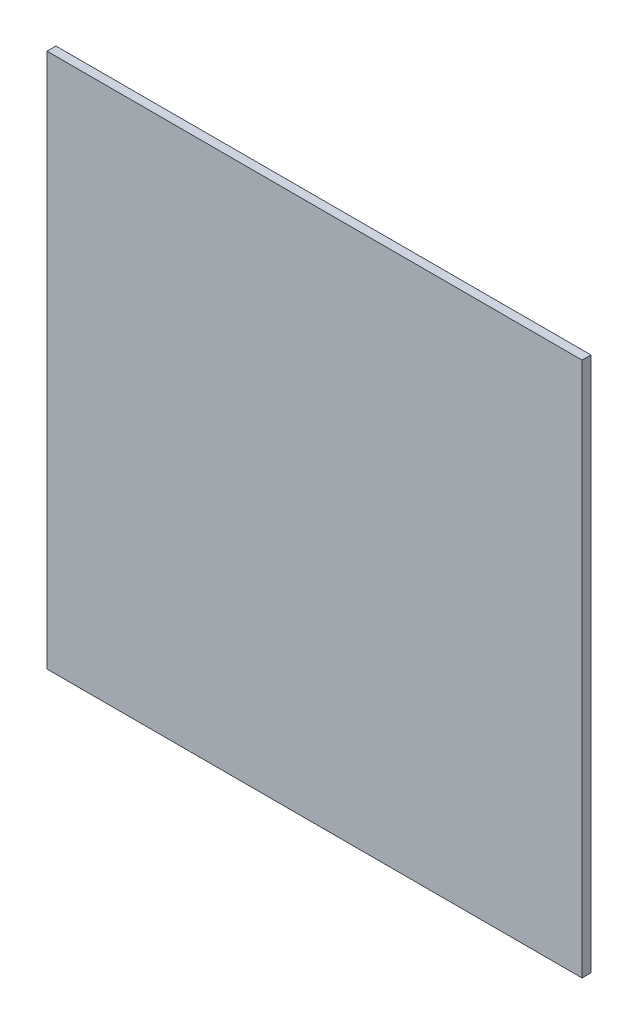
ISO-10303-21;
HEADER;
FILE_DESCRIPTION(('STEP AP214'),'2;1');
FILE_NAME('part.step','',(''),(''),'','','');
FILE_SCHEMA(('AUTOMOTIVE_DESIGN { 1 0 10303 214 1 1 1 1 }'));
ENDSEC;
DATA;
#1=APPLICATION_CONTEXT('core data for automotive mechanical design processes');
#2=APPLICATION_PROTOCOL_DEFINITION('international standard','automotive_design',2000,#1);
#3=PRODUCT_CONTEXT('',#1,'mechanical');
#4=PRODUCT('Part','Part','',(#3));
#5=PRODUCT_RELATED_PRODUCT_CATEGORY('part','',(#4));
#6=PRODUCT_DEFINITION_FORMATION('','',#4);
#7=PRODUCT_DEFINITION_CONTEXT('part definition',#1,'design');
#8=PRODUCT_DEFINITION('design','',#6,#7);
#9=PRODUCT_DEFINITION_SHAPE('','',#8);
#10=(LENGTH_UNIT() NAMED_UNIT(*) SI_UNIT(.MILLI.,.METRE.));
#11=(NAMED_UNIT(*) PLANE_ANGLE_UNIT() SI_UNIT($,.RADIAN.));
#12=(NAMED_UNIT(*) SI_UNIT($,.STERADIAN.) SOLID_ANGLE_UNIT());
#13=UNCERTAINTY_MEASURE_WITH_UNIT(LENGTH_MEASURE(1.E-05),#10,'distance_accuracy_value','');
#14=(GEOMETRIC_REPRESENTATION_CONTEXT(3) GLOBAL_UNCERTAINTY_ASSIGNED_CONTEXT((#13)) GLOBAL_UNIT_ASSIGNED_CONTEXT((#10,
#11,#12)) REPRESENTATION_CONTEXT('',''));
#15=CARTESIAN_POINT('',(0.,0.,0.));
#16=DIRECTION('',(0.,0.,1.));
#17=DIRECTION('',(1.,0.,0.));
#18=AXIS2_PLACEMENT_3D('',#15,#16,#17);
#19=CARTESIAN_POINT('',(-180.,180.,6.));
#20=DIRECTION('',(1.,0.,0.));
#21=DIRECTION('',(0.,1.,0.));
#22=AXIS2_PLACEMENT_3D('',#19,#20,#21);
#23=PLANE('',#22);
#24=DIRECTION('',(0.,-1.,0.));
#25=VECTOR('',#24,1.);
#26=CARTESIAN_POINT('',(-180.,180.,0.));
#27=LINE('',#26,#25);
#28=CARTESIAN_POINT('',(-180.,180.,0.));
#29=VERTEX_POINT('',#28);
#30=CARTESIAN_POINT('',(-180.,-180.,0.));
#31=VERTEX_POINT('',#30);
#32=EDGE_CURVE('E189',#29,#31,#27,.T.);
#33=ORIENTED_EDGE('',*,*,#32,.T.);
#34=DIRECTION('',(0.,0.,-1.));
#35=VECTOR('',#34,1.);
#36=CARTESIAN_POINT('',(-180.,-180.,6.));
#37=LINE('',#36,#35);
#38=CARTESIAN_POINT('',(-180.,-180.,6.));
#39=VERTEX_POINT('',#38);
#40=EDGE_CURVE('E11',#39,#31,#37,.T.);
#41=ORIENTED_EDGE('',*,*,#40,.F.);
#42=DIRECTION('',(0.,-1.,0.));
#43=VECTOR('',#42,1.);
#44=CARTESIAN_POINT('',(-180.,180.,6.));
#45=LINE('',#44,#43);
#46=CARTESIAN_POINT('',(-180.,180.,6.));
#47=VERTEX_POINT('',#46);
#48=EDGE_CURVE('E191',#47,#39,#45,.T.);
#49=ORIENTED_EDGE('',*,*,#48,.F.);
#50=DIRECTION('',(0.,0.,-1.));
#51=VECTOR('',#50,1.);
#52=CARTESIAN_POINT('',(-180.,180.,6.));
#53=LINE('',#52,#51);
#54=EDGE_CURVE('E201',#47,#29,#53,.T.);
#55=ORIENTED_EDGE('',*,*,#54,.T.);
#56=EDGE_LOOP('',(#33,#41,#49,#55));
#57=FACE_BOUND('',#56,.T.);
#58=ADVANCED_FACE('F32',(#57),#23,.F.);
#59=CARTESIAN_POINT('',(-180.,-180.,6.));
#60=DIRECTION('',(0.,1.,0.));
#61=DIRECTION('',(-1.,0.,0.));
#62=AXIS2_PLACEMENT_3D('',#59,#60,#61);
#63=PLANE('',#62);
#64=DIRECTION('',(1.,0.,0.));
#65=VECTOR('',#64,1.);
#66=CARTESIAN_POINT('',(-180.,-180.,0.));
#67=LINE('',#66,#65);
#68=CARTESIAN_POINT('',(180.,-180.,0.));
#69=VERTEX_POINT('',#68);
#70=EDGE_CURVE('E204',#31,#69,#67,.T.);
#71=ORIENTED_EDGE('',*,*,#70,.T.);
#72=DIRECTION('',(0.,0.,-1.));
#73=VECTOR('',#72,1.);
#74=CARTESIAN_POINT('',(180.,-180.,6.));
#75=LINE('',#74,#73);
#76=CARTESIAN_POINT('',(180.,-180.,6.));
#77=VERTEX_POINT('',#76);
#78=EDGE_CURVE('E39',#77,#69,#75,.T.);
#79=ORIENTED_EDGE('',*,*,#78,.F.);
#80=DIRECTION('',(1.,0.,0.));
#81=VECTOR('',#80,1.);
#82=CARTESIAN_POINT('',(-180.,-180.,6.));
#83=LINE('',#82,#81);
#84=EDGE_CURVE('E194',#39,#77,#83,.T.);
#85=ORIENTED_EDGE('',*,*,#84,.F.);
#86=ORIENTED_EDGE('',*,*,#40,.T.);
#87=EDGE_LOOP('',(#71,#79,#85,#86));
#88=FACE_BOUND('',#87,.T.);
#89=ADVANCED_FACE('F234',(#88),#63,.F.);
#90=CARTESIAN_POINT('',(180.,180.,6.));
#91=DIRECTION('',(-1.,0.,0.));
#92=DIRECTION('',(0.,-1.,0.));
#93=AXIS2_PLACEMENT_3D('',#90,#91,#92);
#94=PLANE('',#93);
#95=DIRECTION('',(0.,1.,0.));
#96=VECTOR('',#95,1.);
#97=CARTESIAN_POINT('',(180.,180.,0.));
#98=LINE('',#97,#96);
#99=CARTESIAN_POINT('',(180.,180.,0.));
#100=VERTEX_POINT('',#99);
#101=EDGE_CURVE('E206',#69,#100,#98,.T.);
#102=ORIENTED_EDGE('',*,*,#101,.T.);
#103=DIRECTION('',(0.,0.,-1.));
#104=VECTOR('',#103,1.);
#105=CARTESIAN_POINT('',(180.,180.,6.));
#106=LINE('',#105,#104);
#107=CARTESIAN_POINT('',(180.,180.,6.));
#108=VERTEX_POINT('',#107);
#109=EDGE_CURVE('E211',#108,#100,#106,.T.);
#110=ORIENTED_EDGE('',*,*,#109,.F.);
#111=DIRECTION('',(0.,1.,0.));
#112=VECTOR('',#111,1.);
#113=CARTESIAN_POINT('',(180.,180.,6.));
#114=LINE('',#113,#112);
#115=EDGE_CURVE('E197',#77,#108,#114,.T.);
#116=ORIENTED_EDGE('',*,*,#115,.F.);
#117=ORIENTED_EDGE('',*,*,#78,.T.);
#118=EDGE_LOOP('',(#102,#110,#116,#117));
#119=FACE_BOUND('',#118,.T.);
#120=ADVANCED_FACE('F218',(#119),#94,.F.);
#121=CARTESIAN_POINT('',(-180.,180.,6.));
#122=DIRECTION('',(0.,-1.,0.));
#123=DIRECTION('',(1.,0.,0.));
#124=AXIS2_PLACEMENT_3D('',#121,#122,#123);
#125=PLANE('',#124);
#126=DIRECTION('',(-1.,0.,0.));
#127=VECTOR('',#126,1.);
#128=CARTESIAN_POINT('',(-180.,180.,0.));
#129=LINE('',#128,#127);
#130=EDGE_CURVE('E195',#100,#29,#129,.T.);
#131=ORIENTED_EDGE('',*,*,#130,.T.);
#132=ORIENTED_EDGE('',*,*,#54,.F.);
#133=DIRECTION('',(-1.,0.,0.));
#134=VECTOR('',#133,1.);
#135=CARTESIAN_POINT('',(-180.,180.,6.));
#136=LINE('',#135,#134);
#137=EDGE_CURVE('E199',#108,#47,#136,.T.);
#138=ORIENTED_EDGE('',*,*,#137,.F.);
#139=ORIENTED_EDGE('',*,*,#109,.T.);
#140=EDGE_LOOP('',(#131,#132,#138,#139));
#141=FACE_BOUND('',#140,.T.);
#142=ADVANCED_FACE('F227',(#141),#125,.F.);
#143=CARTESIAN_POINT('',(0.,0.,6.));
#144=DIRECTION('',(0.,0.,1.));
#145=DIRECTION('',(1.,0.,0.));
#146=AXIS2_PLACEMENT_3D('',#143,#144,#145);
#147=PLANE('',#146);
#148=ORIENTED_EDGE('',*,*,#48,.T.);
#149=ORIENTED_EDGE('',*,*,#84,.T.);
#150=ORIENTED_EDGE('',*,*,#115,.T.);
#151=ORIENTED_EDGE('',*,*,#137,.T.);
#152=EDGE_LOOP('',(#148,#149,#150,#151));
#153=FACE_BOUND('',#152,.T.);
#154=ADVANCED_FACE('F233',(#153),#147,.T.);
#155=CARTESIAN_POINT('',(0.,0.,0.));
#156=DIRECTION('',(0.,0.,1.));
#157=DIRECTION('',(1.,0.,0.));
#158=AXIS2_PLACEMENT_3D('',#155,#156,#157);
#159=PLANE('',#158);
#160=DIRECTION('',(-1.,0.,0.));
#161=VECTOR('',#160,1.);
#162=CARTESIAN_POINT('',(100.,-131.,0.));
#163=LINE('',#162,#161);
#164=CARTESIAN_POINT('',(81.,-131.,0.));
#165=VERTEX_POINT('',#164);
#166=CARTESIAN_POINT('',(-81.,-131.,0.));
#167=VERTEX_POINT('',#166);
#168=EDGE_CURVE('E182',#165,#167,#163,.T.);
#169=ORIENTED_EDGE('',*,*,#168,.T.);
#170=DIRECTION('',(0.,-1.,0.));
#171=VECTOR('',#170,1.);
#172=CARTESIAN_POINT('',(-81.,-131.,0.));
#173=LINE('',#172,#171);
#174=CARTESIAN_POINT('',(-81.,86.4679434480897,0.));
#175=VERTEX_POINT('',#174);
#176=EDGE_CURVE('E46',#175,#167,#173,.T.);
#177=ORIENTED_EDGE('',*,*,#176,.F.);
#178=DIRECTION('',(-1.,0.,0.));
#179=VECTOR('',#178,1.);
#180=CARTESIAN_POINT('',(-81.,86.4679434480897,0.));
#181=LINE('',#180,#179);
#182=CARTESIAN_POINT('',(-100.,86.4679434480897,0.));
#183=VERTEX_POINT('',#182);
#184=EDGE_CURVE('E130',#175,#183,#181,.T.);
#185=ORIENTED_EDGE('',*,*,#184,.T.);
#186=DIRECTION('',(0.,-1.,0.));
#187=VECTOR('',#186,1.);
#188=CARTESIAN_POINT('',(-100.,-131.,0.));
#189=LINE('',#188,#187);
#190=CARTESIAN_POINT('',(-100.,-150.,0.));
#191=VERTEX_POINT('',#190);
#192=EDGE_CURVE('E54',#183,#191,#189,.T.);
#193=ORIENTED_EDGE('',*,*,#192,.T.);
#194=DIRECTION('',(1.,0.,0.));
#195=VECTOR('',#194,1.);
#196=CARTESIAN_POINT('',(100.,-150.,0.));
#197=LINE('',#196,#195);
#198=CARTESIAN_POINT('',(100.,-150.,0.));
#199=VERTEX_POINT('',#198);
#200=EDGE_CURVE('E174',#191,#199,#197,.T.);
#201=ORIENTED_EDGE('',*,*,#200,.T.);
#202=DIRECTION('',(0.,1.,0.));
#203=VECTOR('',#202,1.);
#204=CARTESIAN_POINT('',(100.,-131.,0.));
#205=LINE('',#204,#203);
#206=CARTESIAN_POINT('',(100.,86.4679434480897,0.));
#207=VERTEX_POINT('',#206);
#208=EDGE_CURVE('E168',#199,#207,#205,.T.);
#209=ORIENTED_EDGE('',*,*,#208,.T.);
#210=DIRECTION('',(1.,0.,0.));
#211=VECTOR('',#210,1.);
#212=CARTESIAN_POINT('',(81.,86.4679434480897,0.));
#213=LINE('',#212,#211);
#214=CARTESIAN_POINT('',(81.,86.4679434480897,0.));
#215=VERTEX_POINT('',#214);
#216=EDGE_CURVE('E165',#215,#207,#213,.T.);
#217=ORIENTED_EDGE('',*,*,#216,.F.);
#218=DIRECTION('',(0.,-1.,0.));
#219=VECTOR('',#218,1.);
#220=CARTESIAN_POINT('',(81.,-131.,0.));
#221=LINE('',#220,#219);
#222=EDGE_CURVE('E160',#215,#165,#221,.T.);
#223=ORIENTED_EDGE('',*,*,#222,.T.);
#224=EDGE_LOOP('',(#169,#177,#185,#193,#201,#209,#217,#223));
#225=FACE_BOUND('',#224,.T.);
#226=ORIENTED_EDGE('',*,*,#32,.F.);
#227=ORIENTED_EDGE('',*,*,#130,.F.);
#228=ORIENTED_EDGE('',*,*,#101,.F.);
#229=ORIENTED_EDGE('',*,*,#70,.F.);
#230=EDGE_LOOP('',(#226,#227,#228,#229));
#231=FACE_BOUND('',#230,.T.);
#232=ADVANCED_FACE('F224',(#225,#231),#159,.F.);
#233=CARTESIAN_POINT('',(100.,-131.,-70.));
#234=DIRECTION('',(1.,0.,0.));
#235=DIRECTION('',(0.,0.,-1.));
#236=AXIS2_PLACEMENT_3D('',#233,#234,#235);
#237=PLANE('',#236);
#238=ORIENTED_EDGE('',*,*,#208,.F.);
#239=DIRECTION('',(0.,0.,1.));
#240=VECTOR('',#239,1.);
#241=CARTESIAN_POINT('',(100.,-150.,-70.));
#242=LINE('',#241,#240);
#243=CARTESIAN_POINT('',(100.,-150.,-70.));
#244=VERTEX_POINT('',#243);
#245=EDGE_CURVE('E187',#244,#199,#242,.T.);
#246=ORIENTED_EDGE('',*,*,#245,.F.);
#247=DIRECTION('',(0.,1.,0.));
#248=VECTOR('',#247,1.);
#249=CARTESIAN_POINT('',(100.,-131.,-70.));
#250=LINE('',#249,#248);
#251=CARTESIAN_POINT('',(100.,-11.,-70.));
#252=VERTEX_POINT('',#251);
#253=EDGE_CURVE('E171',#244,#252,#250,.T.);
#254=ORIENTED_EDGE('',*,*,#253,.T.);
#255=DIRECTION('',(0.,0.812232862067414,0.583333333333333));
#256=VECTOR('',#255,1.);
#257=CARTESIAN_POINT('',(100.,86.4679434480897,0.));
#258=LINE('',#257,#256);
#259=EDGE_CURVE('E141',#252,#207,#258,.T.);
#260=ORIENTED_EDGE('',*,*,#259,.T.);
#261=EDGE_LOOP('',(#238,#246,#254,#260));
#262=FACE_BOUND('',#261,.T.);
#263=ADVANCED_FACE('F246',(#262),#237,.T.);
#264=CARTESIAN_POINT('',(100.,-150.,-70.));
#265=DIRECTION('',(0.,-1.,0.));
#266=DIRECTION('',(0.,0.,-1.));
#267=AXIS2_PLACEMENT_3D('',#264,#265,#266);
#268=PLANE('',#267);
#269=ORIENTED_EDGE('',*,*,#200,.F.);
#270=DIRECTION('',(0.,0.,1.));
#271=VECTOR('',#270,1.);
#272=CARTESIAN_POINT('',(-100.,-150.,-70.));
#273=LINE('',#272,#271);
#274=CARTESIAN_POINT('',(-100.,-150.,-70.));
#275=VERTEX_POINT('',#274);
#276=EDGE_CURVE('E180',#275,#191,#273,.T.);
#277=ORIENTED_EDGE('',*,*,#276,.F.);
#278=DIRECTION('',(1.,0.,0.));
#279=VECTOR('',#278,1.);
#280=CARTESIAN_POINT('',(100.,-150.,-70.));
#281=LINE('',#280,#279);
#282=EDGE_CURVE('E177',#275,#244,#281,.T.);
#283=ORIENTED_EDGE('',*,*,#282,.T.);
#284=ORIENTED_EDGE('',*,*,#245,.T.);
#285=EDGE_LOOP('',(#269,#277,#283,#284));
#286=FACE_BOUND('',#285,.T.);
#287=ADVANCED_FACE('F251',(#286),#268,.T.);
#288=CARTESIAN_POINT('',(-100.,-131.,-70.));
#289=DIRECTION('',(-1.,0.,0.));
#290=DIRECTION('',(0.,-1.,0.));
#291=AXIS2_PLACEMENT_3D('',#288,#289,#290);
#292=PLANE('',#291);
#293=ORIENTED_EDGE('',*,*,#192,.F.);
#294=DIRECTION('',(0.,0.812232862067414,0.583333333333333));
#295=VECTOR('',#294,1.);
#296=CARTESIAN_POINT('',(-100.,86.4679434480897,0.));
#297=LINE('',#296,#295);
#298=CARTESIAN_POINT('',(-100.,-11.,-70.));
#299=VERTEX_POINT('',#298);
#300=EDGE_CURVE('E148',#299,#183,#297,.T.);
#301=ORIENTED_EDGE('',*,*,#300,.F.);
#302=DIRECTION('',(0.,-1.,0.));
#303=VECTOR('',#302,1.);
#304=CARTESIAN_POINT('',(-100.,-131.,-70.));
#305=LINE('',#304,#303);
#306=EDGE_CURVE('E138',#299,#275,#305,.T.);
#307=ORIENTED_EDGE('',*,*,#306,.T.);
#308=ORIENTED_EDGE('',*,*,#276,.T.);
#309=EDGE_LOOP('',(#293,#301,#307,#308));
#310=FACE_BOUND('',#309,.T.);
#311=ADVANCED_FACE('F256',(#310),#292,.T.);
#312=CARTESIAN_POINT('',(100.,-131.,-70.));
#313=DIRECTION('',(0.,1.,0.));
#314=DIRECTION('',(0.,0.,1.));
#315=AXIS2_PLACEMENT_3D('',#312,#313,#314);
#316=PLANE('',#315);
#317=DIRECTION('',(0.,0.,-1.));
#318=VECTOR('',#317,1.);
#319=CARTESIAN_POINT('',(-81.,-131.,-70.));
#320=LINE('',#319,#318);
#321=CARTESIAN_POINT('',(-81.,-131.,-70.));
#322=VERTEX_POINT('',#321);
#323=EDGE_CURVE('E128',#167,#322,#320,.T.);
#324=ORIENTED_EDGE('',*,*,#323,.F.);
#325=ORIENTED_EDGE('',*,*,#168,.F.);
#326=DIRECTION('',(0.,0.,-1.));
#327=VECTOR('',#326,1.);
#328=CARTESIAN_POINT('',(81.,-131.,-70.));
#329=LINE('',#328,#327);
#330=CARTESIAN_POINT('',(81.,-131.,-70.));
#331=VERTEX_POINT('',#330);
#332=EDGE_CURVE('E151',#165,#331,#329,.T.);
#333=ORIENTED_EDGE('',*,*,#332,.T.);
#334=DIRECTION('',(-1.,0.,0.));
#335=VECTOR('',#334,1.);
#336=CARTESIAN_POINT('',(100.,-131.,-70.));
#337=LINE('',#336,#335);
#338=EDGE_CURVE('E173',#331,#322,#337,.T.);
#339=ORIENTED_EDGE('',*,*,#338,.T.);
#340=EDGE_LOOP('',(#324,#325,#333,#339));
#341=FACE_BOUND('',#340,.T.);
#342=ADVANCED_FACE('F253',(#341),#316,.T.);
#343=CARTESIAN_POINT('',(0.,0.,-70.));
#344=DIRECTION('',(0.,0.,-1.));
#345=DIRECTION('',(-1.,0.,0.));
#346=AXIS2_PLACEMENT_3D('',#343,#344,#345);
#347=PLANE('',#346);
#348=ORIENTED_EDGE('',*,*,#253,.F.);
#349=ORIENTED_EDGE('',*,*,#282,.F.);
#350=ORIENTED_EDGE('',*,*,#306,.F.);
#351=DIRECTION('',(-1.,0.,0.));
#352=VECTOR('',#351,1.);
#353=CARTESIAN_POINT('',(-81.,-11.,-70.));
#354=LINE('',#353,#352);
#355=CARTESIAN_POINT('',(-81.,-11.,-70.));
#356=VERTEX_POINT('',#355);
#357=EDGE_CURVE('E133',#356,#299,#354,.T.);
#358=ORIENTED_EDGE('',*,*,#357,.F.);
#359=DIRECTION('',(0.,1.,0.));
#360=VECTOR('',#359,1.);
#361=CARTESIAN_POINT('',(-81.,-11.,-70.));
#362=LINE('',#361,#360);
#363=EDGE_CURVE('E122',#322,#356,#362,.T.);
#364=ORIENTED_EDGE('',*,*,#363,.F.);
#365=ORIENTED_EDGE('',*,*,#338,.F.);
#366=DIRECTION('',(0.,1.,0.));
#367=VECTOR('',#366,1.);
#368=CARTESIAN_POINT('',(81.,-11.,-70.));
#369=LINE('',#368,#367);
#370=CARTESIAN_POINT('',(81.,-11.,-70.));
#371=VERTEX_POINT('',#370);
#372=EDGE_CURVE('E154',#331,#371,#369,.T.);
#373=ORIENTED_EDGE('',*,*,#372,.T.);
#374=DIRECTION('',(1.,0.,0.));
#375=VECTOR('',#374,1.);
#376=CARTESIAN_POINT('',(81.,-11.,-70.));
#377=LINE('',#376,#375);
#378=EDGE_CURVE('E162',#371,#252,#377,.T.);
#379=ORIENTED_EDGE('',*,*,#378,.T.);
#380=EDGE_LOOP('',(#348,#349,#350,#358,#364,#365,#373,#379));
#381=FACE_BOUND('',#380,.T.);
#382=ADVANCED_FACE('F135',(#381),#347,.T.);
#383=CARTESIAN_POINT('',(81.,86.4679434480897,0.));
#384=DIRECTION('',(0.,0.583333333333333,-0.812232862067414));
#385=DIRECTION('',(0.,0.812232862067414,0.583333333333333));
#386=AXIS2_PLACEMENT_3D('',#383,#384,#385);
#387=PLANE('',#386);
#388=ORIENTED_EDGE('',*,*,#259,.F.);
#389=ORIENTED_EDGE('',*,*,#378,.F.);
#390=DIRECTION('',(0.,0.812232862067414,0.583333333333333));
#391=VECTOR('',#390,1.);
#392=CARTESIAN_POINT('',(81.,86.4679434480897,0.));
#393=LINE('',#392,#391);
#394=EDGE_CURVE('E157',#371,#215,#393,.T.);
#395=ORIENTED_EDGE('',*,*,#394,.T.);
#396=ORIENTED_EDGE('',*,*,#216,.T.);
#397=EDGE_LOOP('',(#388,#389,#395,#396));
#398=FACE_BOUND('',#397,.T.);
#399=ADVANCED_FACE('F265',(#398),#387,.T.);
#400=CARTESIAN_POINT('',(81.,0.,0.));
#401=DIRECTION('',(-1.,0.,0.));
#402=DIRECTION('',(0.,0.,1.));
#403=AXIS2_PLACEMENT_3D('',#400,#401,#402);
#404=PLANE('',#403);
#405=ORIENTED_EDGE('',*,*,#332,.F.);
#406=ORIENTED_EDGE('',*,*,#222,.F.);
#407=ORIENTED_EDGE('',*,*,#394,.F.);
#408=ORIENTED_EDGE('',*,*,#372,.F.);
#409=EDGE_LOOP('',(#405,#406,#407,#408));
#410=FACE_BOUND('',#409,.T.);
#411=ADVANCED_FACE('F268',(#410),#404,.T.);
#412=CARTESIAN_POINT('',(-81.,86.4679434480897,0.));
#413=DIRECTION('',(0.,-0.583333333333333,0.812232862067414));
#414=DIRECTION('',(0.,-0.812232862067414,-0.583333333333333));
#415=AXIS2_PLACEMENT_3D('',#412,#413,#414);
#416=PLANE('',#415);
#417=ORIENTED_EDGE('',*,*,#300,.T.);
#418=ORIENTED_EDGE('',*,*,#184,.F.);
#419=DIRECTION('',(0.,0.812232862067414,0.583333333333333));
#420=VECTOR('',#419,1.);
#421=CARTESIAN_POINT('',(-81.,86.4679434480897,0.));
#422=LINE('',#421,#420);
#423=EDGE_CURVE('E126',#356,#175,#422,.T.);
#424=ORIENTED_EDGE('',*,*,#423,.F.);
#425=ORIENTED_EDGE('',*,*,#357,.T.);
#426=EDGE_LOOP('',(#417,#418,#424,#425));
#427=FACE_BOUND('',#426,.T.);
#428=ADVANCED_FACE('F143',(#427),#416,.F.);
#429=CARTESIAN_POINT('',(-81.,0.,0.));
#430=DIRECTION('',(1.,0.,0.));
#431=DIRECTION('',(0.,0.,1.));
#432=AXIS2_PLACEMENT_3D('',#429,#430,#431);
#433=PLANE('',#432);
#434=ORIENTED_EDGE('',*,*,#323,.T.);
#435=ORIENTED_EDGE('',*,*,#363,.T.);
#436=ORIENTED_EDGE('',*,*,#423,.T.);
#437=ORIENTED_EDGE('',*,*,#176,.T.);
#438=EDGE_LOOP('',(#434,#435,#436,#437));
#439=FACE_BOUND('',#438,.T.);
#440=ADVANCED_FACE('F124',(#439),#433,.T.);
#441=CLOSED_SHELL('',(#58,#89,#120,#142,#154,#232,#263,#287,#311,#342,#382,#399,#411,#428,#440));
#442=MANIFOLD_SOLID_BREP('B2',#441);
#443=ADVANCED_BREP_SHAPE_REPRESENTATION('',(#18,#442),#14);
#444=SHAPE_DEFINITION_REPRESENTATION(#9,#443);
ENDSEC;
END-ISO-10303-21;
